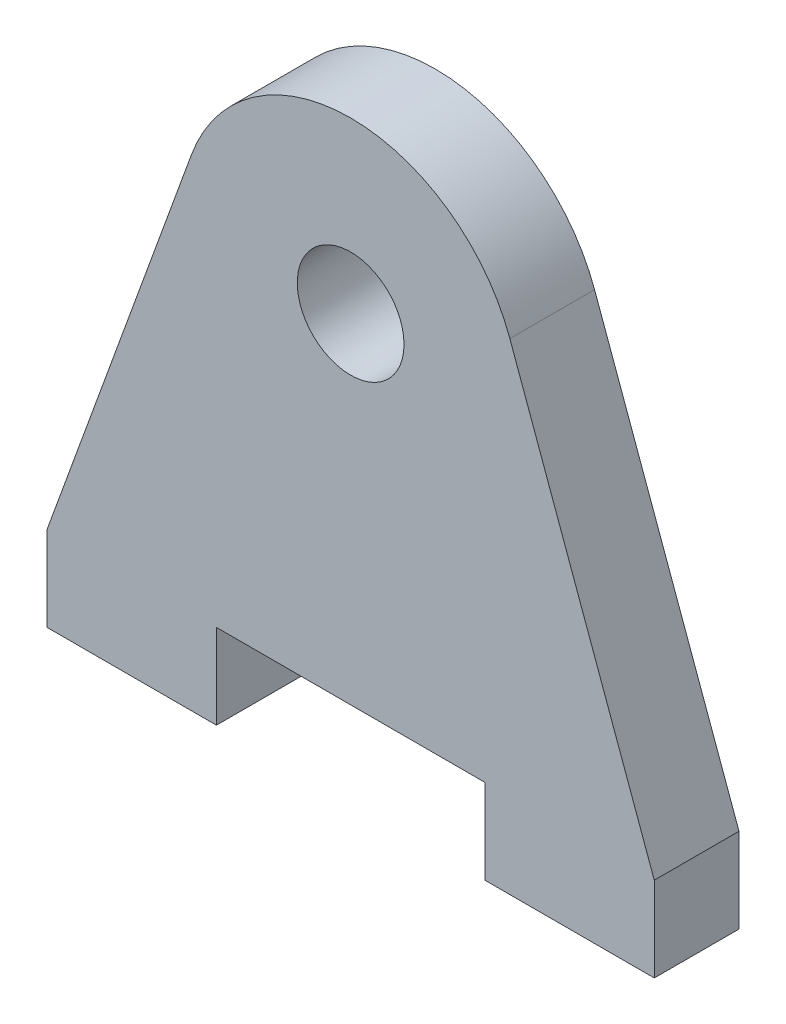
ISO-10303-21;
HEADER;
FILE_DESCRIPTION(('STEP AP214'),'2;1');
FILE_NAME('part.step','',(''),(''),'','','');
FILE_SCHEMA(('AUTOMOTIVE_DESIGN { 1 0 10303 214 1 1 1 1 }'));
ENDSEC;
DATA;
#1=APPLICATION_CONTEXT('core data for automotive mechanical design processes');
#2=APPLICATION_PROTOCOL_DEFINITION('international standard','automotive_design',2000,#1);
#3=PRODUCT_CONTEXT('',#1,'mechanical');
#4=PRODUCT('Part','Part','',(#3));
#5=PRODUCT_RELATED_PRODUCT_CATEGORY('part','',(#4));
#6=PRODUCT_DEFINITION_FORMATION('','',#4);
#7=PRODUCT_DEFINITION_CONTEXT('part definition',#1,'design');
#8=PRODUCT_DEFINITION('design','',#6,#7);
#9=PRODUCT_DEFINITION_SHAPE('','',#8);
#10=(LENGTH_UNIT() NAMED_UNIT(*) SI_UNIT(.MILLI.,.METRE.));
#11=(NAMED_UNIT(*) PLANE_ANGLE_UNIT() SI_UNIT($,.RADIAN.));
#12=(NAMED_UNIT(*) SI_UNIT($,.STERADIAN.) SOLID_ANGLE_UNIT());
#13=UNCERTAINTY_MEASURE_WITH_UNIT(LENGTH_MEASURE(1.E-05),#10,'distance_accuracy_value','');
#14=(GEOMETRIC_REPRESENTATION_CONTEXT(3) GLOBAL_UNCERTAINTY_ASSIGNED_CONTEXT((#13)) GLOBAL_UNIT_ASSIGNED_CONTEXT((#10,
#11,#12)) REPRESENTATION_CONTEXT('',''));
#15=CARTESIAN_POINT('',(0.,0.,0.));
#16=DIRECTION('',(0.,0.,1.));
#17=DIRECTION('',(1.,0.,0.));
#18=AXIS2_PLACEMENT_3D('',#15,#16,#17);
#19=CARTESIAN_POINT('',(-10.0599016608057,0.,6.35));
#20=DIRECTION('',(1.,0.,0.));
#21=DIRECTION('',(0.,0.,-1.));
#22=AXIS2_PLACEMENT_3D('',#19,#20,#21);
#23=PLANE('',#22);
#24=DIRECTION('',(0.,-1.,0.));
#25=VECTOR('',#24,1.);
#26=CARTESIAN_POINT('',(-10.0599016608057,0.,0.));
#27=LINE('',#26,#25);
#28=CARTESIAN_POINT('',(-10.0599016608057,-25.4,0.));
#29=VERTEX_POINT('',#28);
#30=CARTESIAN_POINT('',(-10.0599016608057,-31.75,0.));
#31=VERTEX_POINT('',#30);
#32=EDGE_CURVE('E148',#29,#31,#27,.T.);
#33=ORIENTED_EDGE('',*,*,#32,.F.);
#34=DIRECTION('',(0.,0.,-1.));
#35=VECTOR('',#34,1.);
#36=CARTESIAN_POINT('',(-10.0599016608057,-25.4,6.35));
#37=LINE('',#36,#35);
#38=CARTESIAN_POINT('',(-10.0599016608057,-25.4,6.35));
#39=VERTEX_POINT('',#38);
#40=EDGE_CURVE('E11',#39,#29,#37,.T.);
#41=ORIENTED_EDGE('',*,*,#40,.F.);
#42=DIRECTION('',(0.,-1.,0.));
#43=VECTOR('',#42,1.);
#44=CARTESIAN_POINT('',(-10.0599016608057,0.,6.35));
#45=LINE('',#44,#43);
#46=CARTESIAN_POINT('',(-10.0599016608057,-31.75,6.35));
#47=VERTEX_POINT('',#46);
#48=EDGE_CURVE('E173',#39,#47,#45,.T.);
#49=ORIENTED_EDGE('',*,*,#48,.T.);
#50=DIRECTION('',(0.,0.,-1.));
#51=VECTOR('',#50,1.);
#52=CARTESIAN_POINT('',(-10.0599016608057,-31.75,6.35));
#53=LINE('',#52,#51);
#54=EDGE_CURVE('E96',#47,#31,#53,.T.);
#55=ORIENTED_EDGE('',*,*,#54,.T.);
#56=EDGE_LOOP('',(#33,#41,#49,#55));
#57=FACE_BOUND('',#56,.T.);
#58=ADVANCED_FACE('F39',(#57),#23,.T.);
#59=CARTESIAN_POINT('',(0.,-25.4,6.35));
#60=DIRECTION('',(0.,1.,0.));
#61=DIRECTION('',(0.,0.,1.));
#62=AXIS2_PLACEMENT_3D('',#59,#60,#61);
#63=PLANE('',#62);
#64=DIRECTION('',(1.,0.,0.));
#65=VECTOR('',#64,1.);
#66=CARTESIAN_POINT('',(0.,-25.4,0.));
#67=LINE('',#66,#65);
#68=CARTESIAN_POINT('',(10.0599016608057,-25.4,0.));
#69=VERTEX_POINT('',#68);
#70=EDGE_CURVE('E151',#29,#69,#67,.T.);
#71=ORIENTED_EDGE('',*,*,#70,.T.);
#72=DIRECTION('',(0.,0.,-1.));
#73=VECTOR('',#72,1.);
#74=CARTESIAN_POINT('',(10.0599016608057,-25.4,6.35));
#75=LINE('',#74,#73);
#76=CARTESIAN_POINT('',(10.0599016608057,-25.4,6.35));
#77=VERTEX_POINT('',#76);
#78=EDGE_CURVE('E47',#77,#69,#75,.T.);
#79=ORIENTED_EDGE('',*,*,#78,.F.);
#80=DIRECTION('',(1.,0.,0.));
#81=VECTOR('',#80,1.);
#82=CARTESIAN_POINT('',(0.,-25.4,6.35));
#83=LINE('',#82,#81);
#84=EDGE_CURVE('E212',#39,#77,#83,.T.);
#85=ORIENTED_EDGE('',*,*,#84,.F.);
#86=ORIENTED_EDGE('',*,*,#40,.T.);
#87=EDGE_LOOP('',(#71,#79,#85,#86));
#88=FACE_BOUND('',#87,.T.);
#89=ADVANCED_FACE('F227',(#88),#63,.F.);
#90=CARTESIAN_POINT('',(10.0599016608057,0.,6.35));
#91=DIRECTION('',(1.,0.,0.));
#92=DIRECTION('',(0.,0.,-1.));
#93=AXIS2_PLACEMENT_3D('',#90,#91,#92);
#94=PLANE('',#93);
#95=DIRECTION('',(0.,-1.,0.));
#96=VECTOR('',#95,1.);
#97=CARTESIAN_POINT('',(10.0599016608057,0.,0.));
#98=LINE('',#97,#96);
#99=CARTESIAN_POINT('',(10.0599016608057,-31.75,0.));
#100=VERTEX_POINT('',#99);
#101=EDGE_CURVE('E153',#69,#100,#98,.T.);
#102=ORIENTED_EDGE('',*,*,#101,.T.);
#103=DIRECTION('',(0.,0.,-1.));
#104=VECTOR('',#103,1.);
#105=CARTESIAN_POINT('',(10.0599016608057,-31.75,6.35));
#106=LINE('',#105,#104);
#107=CARTESIAN_POINT('',(10.0599016608057,-31.75,6.35));
#108=VERTEX_POINT('',#107);
#109=EDGE_CURVE('E184',#108,#100,#106,.T.);
#110=ORIENTED_EDGE('',*,*,#109,.F.);
#111=DIRECTION('',(0.,-1.,0.));
#112=VECTOR('',#111,1.);
#113=CARTESIAN_POINT('',(10.0599016608057,0.,6.35));
#114=LINE('',#113,#112);
#115=EDGE_CURVE('E192',#77,#108,#114,.T.);
#116=ORIENTED_EDGE('',*,*,#115,.F.);
#117=ORIENTED_EDGE('',*,*,#78,.T.);
#118=EDGE_LOOP('',(#102,#110,#116,#117));
#119=FACE_BOUND('',#118,.T.);
#120=ADVANCED_FACE('F190',(#119),#94,.F.);
#121=CARTESIAN_POINT('',(0.,-31.75,6.35));
#122=DIRECTION('',(0.,-1.,0.));
#123=DIRECTION('',(0.,0.,-1.));
#124=AXIS2_PLACEMENT_3D('',#121,#122,#123);
#125=PLANE('',#124);
#126=DIRECTION('',(-1.,0.,0.));
#127=VECTOR('',#126,1.);
#128=CARTESIAN_POINT('',(0.,-31.75,0.));
#129=LINE('',#128,#127);
#130=CARTESIAN_POINT('',(22.7599016608056,-31.75,0.));
#131=VERTEX_POINT('',#130);
#132=EDGE_CURVE('E156',#131,#100,#129,.T.);
#133=ORIENTED_EDGE('',*,*,#132,.F.);
#134=DIRECTION('',(0.,0.,-1.));
#135=VECTOR('',#134,1.);
#136=CARTESIAN_POINT('',(22.7599016608056,-31.75,6.35));
#137=LINE('',#136,#135);
#138=CARTESIAN_POINT('',(22.7599016608056,-31.75,6.35));
#139=VERTEX_POINT('',#138);
#140=EDGE_CURVE('E182',#139,#131,#137,.T.);
#141=ORIENTED_EDGE('',*,*,#140,.F.);
#142=DIRECTION('',(-1.,0.,0.));
#143=VECTOR('',#142,1.);
#144=CARTESIAN_POINT('',(0.,-31.75,6.35));
#145=LINE('',#144,#143);
#146=EDGE_CURVE('E205',#139,#108,#145,.T.);
#147=ORIENTED_EDGE('',*,*,#146,.T.);
#148=ORIENTED_EDGE('',*,*,#109,.T.);
#149=EDGE_LOOP('',(#133,#141,#147,#148));
#150=FACE_BOUND('',#149,.T.);
#151=ADVANCED_FACE('F202',(#150),#125,.T.);
#152=CARTESIAN_POINT('',(22.7599016608056,0.,6.35));
#153=DIRECTION('',(1.,0.,0.));
#154=DIRECTION('',(0.,0.,-1.));
#155=AXIS2_PLACEMENT_3D('',#152,#153,#154);
#156=PLANE('',#155);
#157=DIRECTION('',(0.,-1.,0.));
#158=VECTOR('',#157,1.);
#159=CARTESIAN_POINT('',(22.7599016608056,0.,0.));
#160=LINE('',#159,#158);
#161=CARTESIAN_POINT('',(22.7599016608056,-25.4,0.));
#162=VERTEX_POINT('',#161);
#163=EDGE_CURVE('E159',#162,#131,#160,.T.);
#164=ORIENTED_EDGE('',*,*,#163,.F.);
#165=DIRECTION('',(0.,0.,-1.));
#166=VECTOR('',#165,1.);
#167=CARTESIAN_POINT('',(22.7599016608056,-25.4,6.35));
#168=LINE('',#167,#166);
#169=CARTESIAN_POINT('',(22.7599016608056,-25.4,6.35));
#170=VERTEX_POINT('',#169);
#171=EDGE_CURVE('E180',#170,#162,#168,.T.);
#172=ORIENTED_EDGE('',*,*,#171,.F.);
#173=DIRECTION('',(0.,-1.,0.));
#174=VECTOR('',#173,1.);
#175=CARTESIAN_POINT('',(22.7599016608056,0.,6.35));
#176=LINE('',#175,#174);
#177=EDGE_CURVE('E208',#170,#139,#176,.T.);
#178=ORIENTED_EDGE('',*,*,#177,.T.);
#179=ORIENTED_EDGE('',*,*,#140,.T.);
#180=EDGE_LOOP('',(#164,#172,#178,#179));
#181=FACE_BOUND('',#180,.T.);
#182=ADVANCED_FACE('F237',(#181),#156,.T.);
#183=CARTESIAN_POINT('',(11.934096283981,4.343655820236,6.35));
#184=DIRECTION('',(-0.939692620785908,-0.34202014332567,0.));
#185=DIRECTION('',(0.34202014332567,-0.939692620785908,0.));
#186=AXIS2_PLACEMENT_3D('',#183,#184,#185);
#187=PLANE('',#186);
#188=DIRECTION('',(-0.34202014332567,0.939692620785908,0.));
#189=VECTOR('',#188,1.);
#190=CARTESIAN_POINT('',(11.934096283981,4.343655820236,0.));
#191=LINE('',#190,#189);
#192=CARTESIAN_POINT('',(11.934096283981,4.343655820236,0.));
#193=VERTEX_POINT('',#192);
#194=EDGE_CURVE('E162',#162,#193,#191,.T.);
#195=ORIENTED_EDGE('',*,*,#194,.T.);
#196=DIRECTION('',(0.,0.,-1.));
#197=VECTOR('',#196,1.);
#198=CARTESIAN_POINT('',(11.934096283981,4.343655820236,6.35));
#199=LINE('',#198,#197);
#200=CARTESIAN_POINT('',(11.934096283981,4.343655820236,6.35));
#201=VERTEX_POINT('',#200);
#202=EDGE_CURVE('E177',#201,#193,#199,.T.);
#203=ORIENTED_EDGE('',*,*,#202,.F.);
#204=DIRECTION('',(-0.34202014332567,0.939692620785908,0.));
#205=VECTOR('',#204,1.);
#206=CARTESIAN_POINT('',(11.934096283981,4.343655820236,6.35));
#207=LINE('',#206,#205);
#208=EDGE_CURVE('E210',#170,#201,#207,.T.);
#209=ORIENTED_EDGE('',*,*,#208,.F.);
#210=ORIENTED_EDGE('',*,*,#171,.T.);
#211=EDGE_LOOP('',(#195,#203,#209,#210));
#212=FACE_BOUND('',#211,.T.);
#213=ADVANCED_FACE('F219',(#212),#187,.F.);
#214=CARTESIAN_POINT('',(0.,0.,6.35));
#215=DIRECTION('',(0.,0.,-1.));
#216=DIRECTION('',(-1.,0.,0.));
#217=AXIS2_PLACEMENT_3D('',#214,#215,#216);
#218=CYLINDRICAL_SURFACE('',#217,12.7);
#219=CARTESIAN_POINT('',(0.,0.,0.));
#220=DIRECTION('',(0.,0.,1.));
#221=DIRECTION('',(1.,0.,0.));
#222=AXIS2_PLACEMENT_3D('',#219,#220,#221);
#223=CIRCLE('',#222,12.7);
#224=CARTESIAN_POINT('',(-11.934096283981,4.343655820236,0.));
#225=VERTEX_POINT('',#224);
#226=EDGE_CURVE('E164',#193,#225,#223,.T.);
#227=ORIENTED_EDGE('',*,*,#226,.T.);
#228=DIRECTION('',(0.,0.,-1.));
#229=VECTOR('',#228,1.);
#230=CARTESIAN_POINT('',(-11.934096283981,4.343655820236,6.35));
#231=LINE('',#230,#229);
#232=CARTESIAN_POINT('',(-11.934096283981,4.343655820236,6.35));
#233=VERTEX_POINT('',#232);
#234=EDGE_CURVE('E137',#233,#225,#231,.T.);
#235=ORIENTED_EDGE('',*,*,#234,.F.);
#236=CARTESIAN_POINT('',(0.,0.,6.35));
#237=DIRECTION('',(0.,0.,1.));
#238=DIRECTION('',(1.,0.,0.));
#239=AXIS2_PLACEMENT_3D('',#236,#237,#238);
#240=CIRCLE('',#239,12.7);
#241=EDGE_CURVE('E128',#201,#233,#240,.T.);
#242=ORIENTED_EDGE('',*,*,#241,.F.);
#243=ORIENTED_EDGE('',*,*,#202,.T.);
#244=EDGE_LOOP('',(#227,#235,#242,#243));
#245=FACE_BOUND('',#244,.T.);
#246=ADVANCED_FACE('F222',(#245),#218,.T.);
#247=CARTESIAN_POINT('',(-11.934096283981,4.343655820236,6.35));
#248=DIRECTION('',(0.939692620785908,-0.34202014332567,0.));
#249=DIRECTION('',(0.34202014332567,0.939692620785908,0.));
#250=AXIS2_PLACEMENT_3D('',#247,#248,#249);
#251=PLANE('',#250);
#252=DIRECTION('',(-0.34202014332567,-0.939692620785908,0.));
#253=VECTOR('',#252,1.);
#254=CARTESIAN_POINT('',(-11.934096283981,4.343655820236,0.));
#255=LINE('',#254,#253);
#256=CARTESIAN_POINT('',(-22.7599016608057,-25.4,0.));
#257=VERTEX_POINT('',#256);
#258=EDGE_CURVE('E136',#225,#257,#255,.T.);
#259=ORIENTED_EDGE('',*,*,#258,.T.);
#260=DIRECTION('',(0.,0.,-1.));
#261=VECTOR('',#260,1.);
#262=CARTESIAN_POINT('',(-22.7599016608057,-25.4,6.35));
#263=LINE('',#262,#261);
#264=CARTESIAN_POINT('',(-22.7599016608057,-25.4,6.35));
#265=VERTEX_POINT('',#264);
#266=EDGE_CURVE('E133',#265,#257,#263,.T.);
#267=ORIENTED_EDGE('',*,*,#266,.F.);
#268=DIRECTION('',(-0.34202014332567,-0.939692620785908,0.));
#269=VECTOR('',#268,1.);
#270=CARTESIAN_POINT('',(-11.934096283981,4.343655820236,6.35));
#271=LINE('',#270,#269);
#272=EDGE_CURVE('E121',#233,#265,#271,.T.);
#273=ORIENTED_EDGE('',*,*,#272,.F.);
#274=ORIENTED_EDGE('',*,*,#234,.T.);
#275=EDGE_LOOP('',(#259,#267,#273,#274));
#276=FACE_BOUND('',#275,.T.);
#277=ADVANCED_FACE('F134',(#276),#251,.F.);
#278=CARTESIAN_POINT('',(-22.7599016608057,0.,6.35));
#279=DIRECTION('',(1.,0.,0.));
#280=DIRECTION('',(0.,0.,-1.));
#281=AXIS2_PLACEMENT_3D('',#278,#279,#280);
#282=PLANE('',#281);
#283=DIRECTION('',(0.,-1.,0.));
#284=VECTOR('',#283,1.);
#285=CARTESIAN_POINT('',(-22.7599016608057,0.,0.));
#286=LINE('',#285,#284);
#287=CARTESIAN_POINT('',(-22.7599016608057,-31.75,0.));
#288=VERTEX_POINT('',#287);
#289=EDGE_CURVE('E89',#257,#288,#286,.T.);
#290=ORIENTED_EDGE('',*,*,#289,.T.);
#291=DIRECTION('',(0.,0.,-1.));
#292=VECTOR('',#291,1.);
#293=CARTESIAN_POINT('',(-22.7599016608057,-31.75,6.35));
#294=LINE('',#293,#292);
#295=CARTESIAN_POINT('',(-22.7599016608057,-31.75,6.35));
#296=VERTEX_POINT('',#295);
#297=EDGE_CURVE('E138',#296,#288,#294,.T.);
#298=ORIENTED_EDGE('',*,*,#297,.F.);
#299=DIRECTION('',(0.,-1.,0.));
#300=VECTOR('',#299,1.);
#301=CARTESIAN_POINT('',(-22.7599016608057,0.,6.35));
#302=LINE('',#301,#300);
#303=EDGE_CURVE('E126',#265,#296,#302,.T.);
#304=ORIENTED_EDGE('',*,*,#303,.F.);
#305=ORIENTED_EDGE('',*,*,#266,.T.);
#306=EDGE_LOOP('',(#290,#298,#304,#305));
#307=FACE_BOUND('',#306,.T.);
#308=ADVANCED_FACE('F140',(#307),#282,.F.);
#309=CARTESIAN_POINT('',(0.,-31.75,6.35));
#310=DIRECTION('',(0.,1.,0.));
#311=DIRECTION('',(0.,0.,1.));
#312=AXIS2_PLACEMENT_3D('',#309,#310,#311);
#313=PLANE('',#312);
#314=DIRECTION('',(1.,0.,0.));
#315=VECTOR('',#314,1.);
#316=CARTESIAN_POINT('',(0.,-31.75,0.));
#317=LINE('',#316,#315);
#318=EDGE_CURVE('E168',#288,#31,#317,.T.);
#319=ORIENTED_EDGE('',*,*,#318,.T.);
#320=ORIENTED_EDGE('',*,*,#54,.F.);
#321=DIRECTION('',(1.,0.,0.));
#322=VECTOR('',#321,1.);
#323=CARTESIAN_POINT('',(0.,-31.75,6.35));
#324=LINE('',#323,#322);
#325=EDGE_CURVE('E55',#296,#47,#324,.T.);
#326=ORIENTED_EDGE('',*,*,#325,.F.);
#327=ORIENTED_EDGE('',*,*,#297,.T.);
#328=EDGE_LOOP('',(#319,#320,#326,#327));
#329=FACE_BOUND('',#328,.T.);
#330=ADVANCED_FACE('F225',(#329),#313,.F.);
#331=CARTESIAN_POINT('',(0.,0.,6.35));
#332=DIRECTION('',(0.,0.,-1.));
#333=DIRECTION('',(-1.,0.,0.));
#334=AXIS2_PLACEMENT_3D('',#331,#332,#333);
#335=CYLINDRICAL_SURFACE('',#334,4.);
#336=CARTESIAN_POINT('',(0.,0.,6.35));
#337=DIRECTION('',(0.,0.,1.));
#338=DIRECTION('',(1.,0.,0.));
#339=AXIS2_PLACEMENT_3D('',#336,#337,#338);
#340=CIRCLE('',#339,4.);
#341=CARTESIAN_POINT('',(4.,0.,6.35));
#342=VERTEX_POINT('',#341);
#343=EDGE_CURVE('E142',#342,#342,#340,.T.);
#344=ORIENTED_EDGE('',*,*,#343,.T.);
#345=EDGE_LOOP('',(#344));
#346=FACE_BOUND('',#345,.T.);
#347=CARTESIAN_POINT('',(0.,0.,0.));
#348=DIRECTION('',(0.,0.,1.));
#349=DIRECTION('',(1.,0.,0.));
#350=AXIS2_PLACEMENT_3D('',#347,#348,#349);
#351=CIRCLE('',#350,4.);
#352=CARTESIAN_POINT('',(4.,0.,0.));
#353=VERTEX_POINT('',#352);
#354=EDGE_CURVE('E170',#353,#353,#351,.T.);
#355=ORIENTED_EDGE('',*,*,#354,.F.);
#356=EDGE_LOOP('',(#355));
#357=FACE_BOUND('',#356,.T.);
#358=ADVANCED_FACE('F251',(#346,#357),#335,.F.);
#359=CARTESIAN_POINT('',(0.,0.,6.35));
#360=DIRECTION('',(0.,0.,1.));
#361=DIRECTION('',(1.,0.,0.));
#362=AXIS2_PLACEMENT_3D('',#359,#360,#361);
#363=PLANE('',#362);
#364=ORIENTED_EDGE('',*,*,#48,.F.);
#365=ORIENTED_EDGE('',*,*,#84,.T.);
#366=ORIENTED_EDGE('',*,*,#115,.T.);
#367=ORIENTED_EDGE('',*,*,#146,.F.);
#368=ORIENTED_EDGE('',*,*,#177,.F.);
#369=ORIENTED_EDGE('',*,*,#208,.T.);
#370=ORIENTED_EDGE('',*,*,#241,.T.);
#371=ORIENTED_EDGE('',*,*,#272,.T.);
#372=ORIENTED_EDGE('',*,*,#303,.T.);
#373=ORIENTED_EDGE('',*,*,#325,.T.);
#374=EDGE_LOOP('',(#364,#365,#366,#367,#368,#369,#370,#371,#372,#373));
#375=FACE_BOUND('',#374,.T.);
#376=ORIENTED_EDGE('',*,*,#343,.F.);
#377=EDGE_LOOP('',(#376));
#378=FACE_BOUND('',#377,.T.);
#379=ADVANCED_FACE('F123',(#375,#378),#363,.T.);
#380=CARTESIAN_POINT('',(0.,0.,0.));
#381=DIRECTION('',(0.,0.,1.));
#382=DIRECTION('',(1.,0.,0.));
#383=AXIS2_PLACEMENT_3D('',#380,#381,#382);
#384=PLANE('',#383);
#385=ORIENTED_EDGE('',*,*,#32,.T.);
#386=ORIENTED_EDGE('',*,*,#318,.F.);
#387=ORIENTED_EDGE('',*,*,#289,.F.);
#388=ORIENTED_EDGE('',*,*,#258,.F.);
#389=ORIENTED_EDGE('',*,*,#226,.F.);
#390=ORIENTED_EDGE('',*,*,#194,.F.);
#391=ORIENTED_EDGE('',*,*,#163,.T.);
#392=ORIENTED_EDGE('',*,*,#132,.T.);
#393=ORIENTED_EDGE('',*,*,#101,.F.);
#394=ORIENTED_EDGE('',*,*,#70,.F.);
#395=EDGE_LOOP('',(#385,#386,#387,#388,#389,#390,#391,#392,#393,#394));
#396=FACE_BOUND('',#395,.T.);
#397=ORIENTED_EDGE('',*,*,#354,.T.);
#398=EDGE_LOOP('',(#397));
#399=FACE_BOUND('',#398,.T.);
#400=ADVANCED_FACE('F196',(#396,#399),#384,.F.);
#401=CLOSED_SHELL('',(#58,#89,#120,#151,#182,#213,#246,#277,#308,#330,#358,#379,#400));
#402=MANIFOLD_SOLID_BREP('B2',#401);
#403=ADVANCED_BREP_SHAPE_REPRESENTATION('',(#18,#402),#14);
#404=SHAPE_DEFINITION_REPRESENTATION(#9,#403);
ENDSEC;
END-ISO-10303-21;
